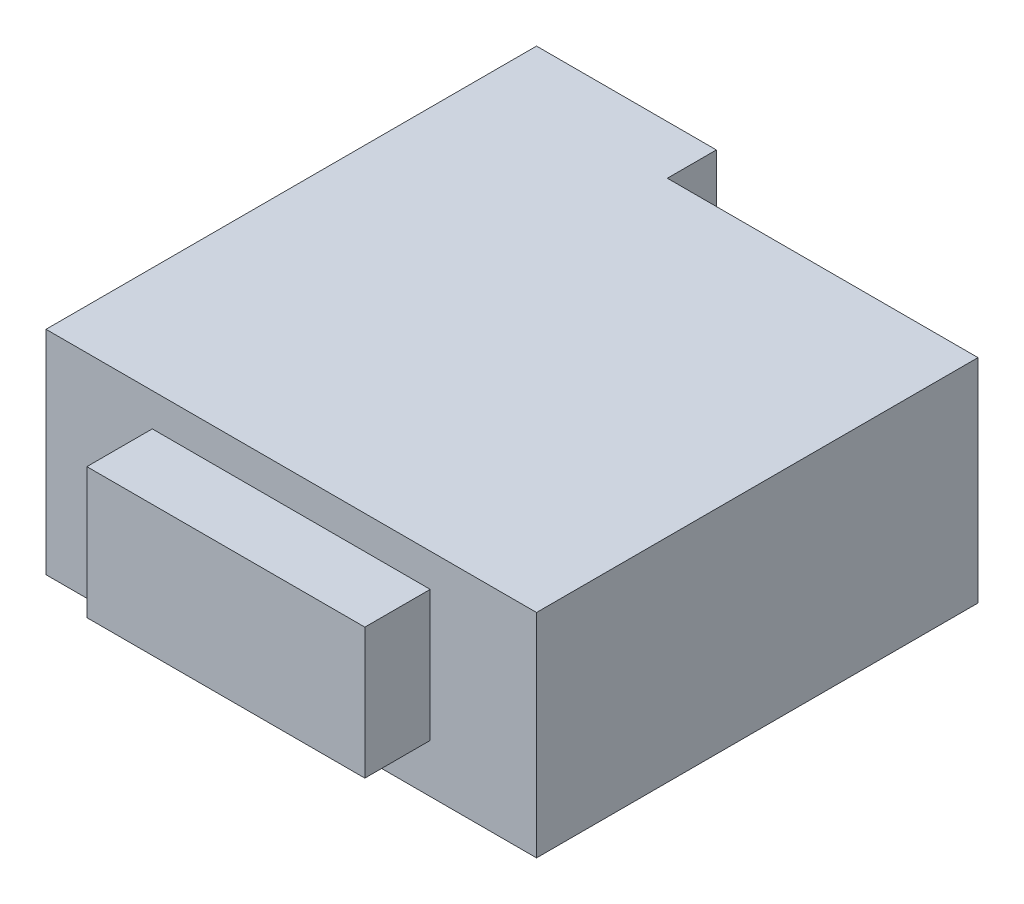
ISO-10303-21;
HEADER;
FILE_DESCRIPTION(('STEP AP214'),'2;1');
FILE_NAME('part.step','',(''),(''),'','','');
FILE_SCHEMA(('AUTOMOTIVE_DESIGN { 1 0 10303 214 1 1 1 1 }'));
ENDSEC;
DATA;
#1=APPLICATION_CONTEXT('core data for automotive mechanical design processes');
#2=APPLICATION_PROTOCOL_DEFINITION('international standard','automotive_design',2000,#1);
#3=PRODUCT_CONTEXT('',#1,'mechanical');
#4=PRODUCT('Part','Part','',(#3));
#5=PRODUCT_RELATED_PRODUCT_CATEGORY('part','',(#4));
#6=PRODUCT_DEFINITION_FORMATION('','',#4);
#7=PRODUCT_DEFINITION_CONTEXT('part definition',#1,'design');
#8=PRODUCT_DEFINITION('design','',#6,#7);
#9=PRODUCT_DEFINITION_SHAPE('','',#8);
#10=(LENGTH_UNIT() NAMED_UNIT(*) SI_UNIT(.MILLI.,.METRE.));
#11=(NAMED_UNIT(*) PLANE_ANGLE_UNIT() SI_UNIT($,.RADIAN.));
#12=(NAMED_UNIT(*) SI_UNIT($,.STERADIAN.) SOLID_ANGLE_UNIT());
#13=UNCERTAINTY_MEASURE_WITH_UNIT(LENGTH_MEASURE(1.E-05),#10,'distance_accuracy_value','');
#14=(GEOMETRIC_REPRESENTATION_CONTEXT(3) GLOBAL_UNCERTAINTY_ASSIGNED_CONTEXT((#13)) GLOBAL_UNIT_ASSIGNED_CONTEXT((#10,
#11,#12)) REPRESENTATION_CONTEXT('',''));
#15=CARTESIAN_POINT('',(0.,0.,0.));
#16=DIRECTION('',(0.,0.,1.));
#17=DIRECTION('',(1.,0.,0.));
#18=AXIS2_PLACEMENT_3D('',#15,#16,#17);
#19=CARTESIAN_POINT('',(-150.,130.,135.));
#20=DIRECTION('',(0.,0.,-1.));
#21=DIRECTION('',(-1.,0.,0.));
#22=AXIS2_PLACEMENT_3D('',#19,#20,#21);
#23=PLANE('',#22);
#24=DIRECTION('',(1.,0.,0.));
#25=VECTOR('',#24,1.);
#26=CARTESIAN_POINT('',(-150.,0.,135.));
#27=LINE('',#26,#25);
#28=CARTESIAN_POINT('',(-150.,0.,135.));
#29=VERTEX_POINT('',#28);
#30=CARTESIAN_POINT('',(150.,0.,135.));
#31=VERTEX_POINT('',#30);
#32=EDGE_CURVE('E165',#29,#31,#27,.T.);
#33=ORIENTED_EDGE('',*,*,#32,.T.);
#34=DIRECTION('',(0.,-1.,0.));
#35=VECTOR('',#34,1.);
#36=CARTESIAN_POINT('',(150.,130.,135.));
#37=LINE('',#36,#35);
#38=CARTESIAN_POINT('',(150.,130.,135.));
#39=VERTEX_POINT('',#38);
#40=EDGE_CURVE('E172',#39,#31,#37,.T.);
#41=ORIENTED_EDGE('',*,*,#40,.F.);
#42=DIRECTION('',(1.,0.,0.));
#43=VECTOR('',#42,1.);
#44=CARTESIAN_POINT('',(-150.,130.,135.));
#45=LINE('',#44,#43);
#46=CARTESIAN_POINT('',(-150.,130.,135.));
#47=VERTEX_POINT('',#46);
#48=EDGE_CURVE('E170',#47,#39,#45,.T.);
#49=ORIENTED_EDGE('',*,*,#48,.F.);
#50=DIRECTION('',(0.,-1.,0.));
#51=VECTOR('',#50,1.);
#52=CARTESIAN_POINT('',(-150.,130.,135.));
#53=LINE('',#52,#51);
#54=EDGE_CURVE('E47',#47,#29,#53,.T.);
#55=ORIENTED_EDGE('',*,*,#54,.T.);
#56=EDGE_LOOP('',(#33,#41,#49,#55));
#57=FACE_BOUND('',#56,.T.);
#58=DIRECTION('',(0.,-1.,0.));
#59=VECTOR('',#58,1.);
#60=CARTESIAN_POINT('',(-85.,29.7512475730857,135.));
#61=LINE('',#60,#59);
#62=CARTESIAN_POINT('',(-85.,109.751247573086,135.));
#63=VERTEX_POINT('',#62);
#64=CARTESIAN_POINT('',(-85.,29.7512475730857,135.));
#65=VERTEX_POINT('',#64);
#66=EDGE_CURVE('E54',#63,#65,#61,.T.);
#67=ORIENTED_EDGE('',*,*,#66,.F.);
#68=DIRECTION('',(-1.,0.,0.));
#69=VECTOR('',#68,1.);
#70=CARTESIAN_POINT('',(-85.,109.751247573086,135.));
#71=LINE('',#70,#69);
#72=CARTESIAN_POINT('',(85.,109.751247573086,135.));
#73=VERTEX_POINT('',#72);
#74=EDGE_CURVE('E58',#73,#63,#71,.T.);
#75=ORIENTED_EDGE('',*,*,#74,.F.);
#76=DIRECTION('',(0.,1.,0.));
#77=VECTOR('',#76,1.);
#78=CARTESIAN_POINT('',(85.,29.7512475730858,135.));
#79=LINE('',#78,#77);
#80=CARTESIAN_POINT('',(85.,29.7512475730858,135.));
#81=VERTEX_POINT('',#80);
#82=EDGE_CURVE('E379',#81,#73,#79,.T.);
#83=ORIENTED_EDGE('',*,*,#82,.F.);
#84=DIRECTION('',(1.,0.,0.));
#85=VECTOR('',#84,1.);
#86=CARTESIAN_POINT('',(-85.,29.7512475730857,135.));
#87=LINE('',#86,#85);
#88=EDGE_CURVE('E385',#65,#81,#87,.T.);
#89=ORIENTED_EDGE('',*,*,#88,.F.);
#90=EDGE_LOOP('',(#67,#75,#83,#89));
#91=FACE_BOUND('',#90,.T.);
#92=ADVANCED_FACE('F39',(#57,#91),#23,.F.);
#93=CARTESIAN_POINT('',(-150.,130.,-135.));
#94=DIRECTION('',(0.,0.,1.));
#95=DIRECTION('',(1.,0.,0.));
#96=AXIS2_PLACEMENT_3D('',#93,#94,#95);
#97=PLANE('',#96);
#98=DIRECTION('',(0.,-1.,0.));
#99=VECTOR('',#98,1.);
#100=CARTESIAN_POINT('',(-40.,0.,-135.));
#101=LINE('',#100,#99);
#102=CARTESIAN_POINT('',(-40.,130.,-135.));
#103=VERTEX_POINT('',#102);
#104=CARTESIAN_POINT('',(-40.,0.,-135.));
#105=VERTEX_POINT('',#104);
#106=EDGE_CURVE('E136',#103,#105,#101,.T.);
#107=ORIENTED_EDGE('',*,*,#106,.F.);
#108=DIRECTION('',(-1.,0.,0.));
#109=VECTOR('',#108,1.);
#110=CARTESIAN_POINT('',(-150.,130.,-135.));
#111=LINE('',#110,#109);
#112=CARTESIAN_POINT('',(150.,130.,-135.));
#113=VERTEX_POINT('',#112);
#114=EDGE_CURVE('E164',#113,#103,#111,.T.);
#115=ORIENTED_EDGE('',*,*,#114,.F.);
#116=DIRECTION('',(0.,-1.,0.));
#117=VECTOR('',#116,1.);
#118=CARTESIAN_POINT('',(150.,130.,-135.));
#119=LINE('',#118,#117);
#120=CARTESIAN_POINT('',(150.,0.,-135.));
#121=VERTEX_POINT('',#120);
#122=EDGE_CURVE('E11',#113,#121,#119,.T.);
#123=ORIENTED_EDGE('',*,*,#122,.T.);
#124=DIRECTION('',(-1.,0.,0.));
#125=VECTOR('',#124,1.);
#126=CARTESIAN_POINT('',(-150.,0.,-135.));
#127=LINE('',#126,#125);
#128=EDGE_CURVE('E175',#121,#105,#127,.T.);
#129=ORIENTED_EDGE('',*,*,#128,.T.);
#130=EDGE_LOOP('',(#107,#115,#123,#129));
#131=FACE_BOUND('',#130,.T.);
#132=ADVANCED_FACE('F208',(#131),#97,.F.);
#133=CARTESIAN_POINT('',(150.,130.,135.));
#134=DIRECTION('',(-1.,0.,0.));
#135=DIRECTION('',(0.,0.,1.));
#136=AXIS2_PLACEMENT_3D('',#133,#134,#135);
#137=PLANE('',#136);
#138=DIRECTION('',(0.,0.,-1.));
#139=VECTOR('',#138,1.);
#140=CARTESIAN_POINT('',(150.,0.,135.));
#141=LINE('',#140,#139);
#142=EDGE_CURVE('E160',#31,#121,#141,.T.);
#143=ORIENTED_EDGE('',*,*,#142,.T.);
#144=ORIENTED_EDGE('',*,*,#122,.F.);
#145=DIRECTION('',(0.,0.,-1.));
#146=VECTOR('',#145,1.);
#147=CARTESIAN_POINT('',(150.,130.,135.));
#148=LINE('',#147,#146);
#149=EDGE_CURVE('E161',#39,#113,#148,.T.);
#150=ORIENTED_EDGE('',*,*,#149,.F.);
#151=ORIENTED_EDGE('',*,*,#40,.T.);
#152=EDGE_LOOP('',(#143,#144,#150,#151));
#153=FACE_BOUND('',#152,.T.);
#154=ADVANCED_FACE('F41',(#153),#137,.F.);
#155=CARTESIAN_POINT('',(-150.,130.,135.));
#156=DIRECTION('',(1.,0.,0.));
#157=DIRECTION('',(0.,0.,-1.));
#158=AXIS2_PLACEMENT_3D('',#155,#156,#157);
#159=PLANE('',#158);
#160=DIRECTION('',(0.,0.,1.));
#161=VECTOR('',#160,1.);
#162=CARTESIAN_POINT('',(-150.,0.,135.));
#163=LINE('',#162,#161);
#164=CARTESIAN_POINT('',(-150.,0.,-165.));
#165=VERTEX_POINT('',#164);
#166=EDGE_CURVE('E177',#165,#29,#163,.T.);
#167=ORIENTED_EDGE('',*,*,#166,.T.);
#168=ORIENTED_EDGE('',*,*,#54,.F.);
#169=DIRECTION('',(0.,0.,1.));
#170=VECTOR('',#169,1.);
#171=CARTESIAN_POINT('',(-150.,130.,135.));
#172=LINE('',#171,#170);
#173=CARTESIAN_POINT('',(-150.,130.,-165.));
#174=VERTEX_POINT('',#173);
#175=EDGE_CURVE('E168',#174,#47,#172,.T.);
#176=ORIENTED_EDGE('',*,*,#175,.F.);
#177=DIRECTION('',(0.,1.,0.));
#178=VECTOR('',#177,1.);
#179=CARTESIAN_POINT('',(-150.,0.,-165.));
#180=LINE('',#179,#178);
#181=EDGE_CURVE('E139',#165,#174,#180,.T.);
#182=ORIENTED_EDGE('',*,*,#181,.F.);
#183=EDGE_LOOP('',(#167,#168,#176,#182));
#184=FACE_BOUND('',#183,.T.);
#185=ADVANCED_FACE('F200',(#184),#159,.F.);
#186=CARTESIAN_POINT('',(0.,130.,0.));
#187=DIRECTION('',(0.,-1.,0.));
#188=DIRECTION('',(0.,0.,-1.));
#189=AXIS2_PLACEMENT_3D('',#186,#187,#188);
#190=PLANE('',#189);
#191=ORIENTED_EDGE('',*,*,#149,.T.);
#192=ORIENTED_EDGE('',*,*,#114,.T.);
#193=DIRECTION('',(0.,0.,1.));
#194=VECTOR('',#193,1.);
#195=CARTESIAN_POINT('',(-40.,130.,-165.));
#196=LINE('',#195,#194);
#197=CARTESIAN_POINT('',(-40.,130.,-165.));
#198=VERTEX_POINT('',#197);
#199=EDGE_CURVE('E157',#198,#103,#196,.T.);
#200=ORIENTED_EDGE('',*,*,#199,.F.);
#201=DIRECTION('',(1.,0.,0.));
#202=VECTOR('',#201,1.);
#203=CARTESIAN_POINT('',(-150.,130.,-165.));
#204=LINE('',#203,#202);
#205=EDGE_CURVE('E147',#174,#198,#204,.T.);
#206=ORIENTED_EDGE('',*,*,#205,.F.);
#207=ORIENTED_EDGE('',*,*,#175,.T.);
#208=ORIENTED_EDGE('',*,*,#48,.T.);
#209=EDGE_LOOP('',(#191,#192,#200,#206,#207,#208));
#210=FACE_BOUND('',#209,.T.);
#211=ADVANCED_FACE('F196',(#210),#190,.F.);
#212=CARTESIAN_POINT('',(0.,0.,0.));
#213=DIRECTION('',(0.,-1.,0.));
#214=DIRECTION('',(0.,0.,-1.));
#215=AXIS2_PLACEMENT_3D('',#212,#213,#214);
#216=PLANE('',#215);
#217=ORIENTED_EDGE('',*,*,#142,.F.);
#218=ORIENTED_EDGE('',*,*,#32,.F.);
#219=ORIENTED_EDGE('',*,*,#166,.F.);
#220=DIRECTION('',(-1.,0.,0.));
#221=VECTOR('',#220,1.);
#222=CARTESIAN_POINT('',(-150.,0.,-165.));
#223=LINE('',#222,#221);
#224=CARTESIAN_POINT('',(-40.,0.,-165.));
#225=VERTEX_POINT('',#224);
#226=EDGE_CURVE('E151',#225,#165,#223,.T.);
#227=ORIENTED_EDGE('',*,*,#226,.F.);
#228=DIRECTION('',(0.,0.,1.));
#229=VECTOR('',#228,1.);
#230=CARTESIAN_POINT('',(-40.,0.,-165.));
#231=LINE('',#230,#229);
#232=EDGE_CURVE('E153',#225,#105,#231,.T.);
#233=ORIENTED_EDGE('',*,*,#232,.T.);
#234=ORIENTED_EDGE('',*,*,#128,.F.);
#235=EDGE_LOOP('',(#217,#218,#219,#227,#233,#234));
#236=FACE_BOUND('',#235,.T.);
#237=ADVANCED_FACE('F190',(#236),#216,.T.);
#238=CARTESIAN_POINT('',(-40.,0.,-165.));
#239=DIRECTION('',(-1.,0.,0.));
#240=DIRECTION('',(0.,-1.,0.));
#241=AXIS2_PLACEMENT_3D('',#238,#239,#240);
#242=PLANE('',#241);
#243=ORIENTED_EDGE('',*,*,#106,.T.);
#244=ORIENTED_EDGE('',*,*,#232,.F.);
#245=DIRECTION('',(0.,-1.,0.));
#246=VECTOR('',#245,1.);
#247=CARTESIAN_POINT('',(-40.,0.,-165.));
#248=LINE('',#247,#246);
#249=EDGE_CURVE('E149',#198,#225,#248,.T.);
#250=ORIENTED_EDGE('',*,*,#249,.F.);
#251=ORIENTED_EDGE('',*,*,#199,.T.);
#252=EDGE_LOOP('',(#243,#244,#250,#251));
#253=FACE_BOUND('',#252,.T.);
#254=ADVANCED_FACE('F206',(#253),#242,.F.);
#255=CARTESIAN_POINT('',(0.,0.,-165.));
#256=DIRECTION('',(0.,0.,-1.));
#257=DIRECTION('',(-1.,0.,0.));
#258=AXIS2_PLACEMENT_3D('',#255,#256,#257);
#259=PLANE('',#258);
#260=ORIENTED_EDGE('',*,*,#181,.T.);
#261=ORIENTED_EDGE('',*,*,#205,.T.);
#262=ORIENTED_EDGE('',*,*,#249,.T.);
#263=ORIENTED_EDGE('',*,*,#226,.T.);
#264=EDGE_LOOP('',(#260,#261,#262,#263));
#265=FACE_BOUND('',#264,.T.);
#266=ADVANCED_FACE('F202',(#265),#259,.T.);
#267=CARTESIAN_POINT('',(-85.,29.7512475730857,175.));
#268=DIRECTION('',(1.,0.,0.));
#269=DIRECTION('',(0.,0.,-1.));
#270=AXIS2_PLACEMENT_3D('',#267,#268,#269);
#271=PLANE('',#270);
#272=ORIENTED_EDGE('',*,*,#66,.T.);
#273=DIRECTION('',(0.,0.,-1.));
#274=VECTOR('',#273,1.);
#275=CARTESIAN_POINT('',(-85.,29.7512475730857,175.));
#276=LINE('',#275,#274);
#277=CARTESIAN_POINT('',(-85.,29.7512475730857,175.));
#278=VERTEX_POINT('',#277);
#279=EDGE_CURVE('E119',#278,#65,#276,.T.);
#280=ORIENTED_EDGE('',*,*,#279,.F.);
#281=DIRECTION('',(0.,-1.,0.));
#282=VECTOR('',#281,1.);
#283=CARTESIAN_POINT('',(-85.,29.7512475730857,175.));
#284=LINE('',#283,#282);
#285=CARTESIAN_POINT('',(-85.,109.751247573086,175.));
#286=VERTEX_POINT('',#285);
#287=EDGE_CURVE('E125',#286,#278,#284,.T.);
#288=ORIENTED_EDGE('',*,*,#287,.F.);
#289=DIRECTION('',(0.,0.,-1.));
#290=VECTOR('',#289,1.);
#291=CARTESIAN_POINT('',(-85.,109.751247573086,175.));
#292=LINE('',#291,#290);
#293=EDGE_CURVE('E377',#286,#63,#292,.T.);
#294=ORIENTED_EDGE('',*,*,#293,.T.);
#295=EDGE_LOOP('',(#272,#280,#288,#294));
#296=FACE_BOUND('',#295,.T.);
#297=ADVANCED_FACE('F135',(#296),#271,.F.);
#298=CARTESIAN_POINT('',(-85.,29.7512475730857,175.));
#299=DIRECTION('',(0.,1.,0.));
#300=DIRECTION('',(-1.,0.,0.));
#301=AXIS2_PLACEMENT_3D('',#298,#299,#300);
#302=PLANE('',#301);
#303=ORIENTED_EDGE('',*,*,#88,.T.);
#304=DIRECTION('',(0.,0.,-1.));
#305=VECTOR('',#304,1.);
#306=CARTESIAN_POINT('',(85.,29.7512475730858,175.));
#307=LINE('',#306,#305);
#308=CARTESIAN_POINT('',(85.,29.7512475730858,175.));
#309=VERTEX_POINT('',#308);
#310=EDGE_CURVE('E121',#309,#81,#307,.T.);
#311=ORIENTED_EDGE('',*,*,#310,.F.);
#312=DIRECTION('',(1.,0.,0.));
#313=VECTOR('',#312,1.);
#314=CARTESIAN_POINT('',(-85.,29.7512475730857,175.));
#315=LINE('',#314,#313);
#316=EDGE_CURVE('E114',#278,#309,#315,.T.);
#317=ORIENTED_EDGE('',*,*,#316,.F.);
#318=ORIENTED_EDGE('',*,*,#279,.T.);
#319=EDGE_LOOP('',(#303,#311,#317,#318));
#320=FACE_BOUND('',#319,.T.);
#321=ADVANCED_FACE('F117',(#320),#302,.F.);
#322=CARTESIAN_POINT('',(85.,29.7512475730858,175.));
#323=DIRECTION('',(-1.,0.,0.));
#324=DIRECTION('',(0.,-1.,0.));
#325=AXIS2_PLACEMENT_3D('',#322,#323,#324);
#326=PLANE('',#325);
#327=ORIENTED_EDGE('',*,*,#82,.T.);
#328=DIRECTION('',(0.,0.,-1.));
#329=VECTOR('',#328,1.);
#330=CARTESIAN_POINT('',(85.,109.751247573086,175.));
#331=LINE('',#330,#329);
#332=CARTESIAN_POINT('',(85.,109.751247573086,175.));
#333=VERTEX_POINT('',#332);
#334=EDGE_CURVE('E141',#333,#73,#331,.T.);
#335=ORIENTED_EDGE('',*,*,#334,.F.);
#336=DIRECTION('',(0.,1.,0.));
#337=VECTOR('',#336,1.);
#338=CARTESIAN_POINT('',(85.,29.7512475730858,175.));
#339=LINE('',#338,#337);
#340=EDGE_CURVE('E124',#309,#333,#339,.T.);
#341=ORIENTED_EDGE('',*,*,#340,.F.);
#342=ORIENTED_EDGE('',*,*,#310,.T.);
#343=EDGE_LOOP('',(#327,#335,#341,#342));
#344=FACE_BOUND('',#343,.T.);
#345=ADVANCED_FACE('F230',(#344),#326,.F.);
#346=CARTESIAN_POINT('',(-85.,109.751247573086,175.));
#347=DIRECTION('',(0.,-1.,0.));
#348=DIRECTION('',(1.,0.,0.));
#349=AXIS2_PLACEMENT_3D('',#346,#347,#348);
#350=PLANE('',#349);
#351=ORIENTED_EDGE('',*,*,#74,.T.);
#352=ORIENTED_EDGE('',*,*,#293,.F.);
#353=DIRECTION('',(-1.,0.,0.));
#354=VECTOR('',#353,1.);
#355=CARTESIAN_POINT('',(-85.,109.751247573086,175.));
#356=LINE('',#355,#354);
#357=EDGE_CURVE('E130',#333,#286,#356,.T.);
#358=ORIENTED_EDGE('',*,*,#357,.F.);
#359=ORIENTED_EDGE('',*,*,#334,.T.);
#360=EDGE_LOOP('',(#351,#352,#358,#359));
#361=FACE_BOUND('',#360,.T.);
#362=ADVANCED_FACE('F233',(#361),#350,.F.);
#363=CARTESIAN_POINT('',(0.,0.,175.));
#364=DIRECTION('',(0.,0.,-1.));
#365=DIRECTION('',(-1.,0.,0.));
#366=AXIS2_PLACEMENT_3D('',#363,#364,#365);
#367=PLANE('',#366);
#368=ORIENTED_EDGE('',*,*,#287,.T.);
#369=ORIENTED_EDGE('',*,*,#316,.T.);
#370=ORIENTED_EDGE('',*,*,#340,.T.);
#371=ORIENTED_EDGE('',*,*,#357,.T.);
#372=EDGE_LOOP('',(#368,#369,#370,#371));
#373=FACE_BOUND('',#372,.T.);
#374=ADVANCED_FACE('F128',(#373),#367,.F.);
#375=CLOSED_SHELL('',(#92,#132,#154,#185,#211,#237,#254,#266,#297,#321,#345,#362,#374));
#376=MANIFOLD_SOLID_BREP('B2',#375);
#377=ADVANCED_BREP_SHAPE_REPRESENTATION('',(#18,#376),#14);
#378=SHAPE_DEFINITION_REPRESENTATION(#9,#377);
ENDSEC;
END-ISO-10303-21;
